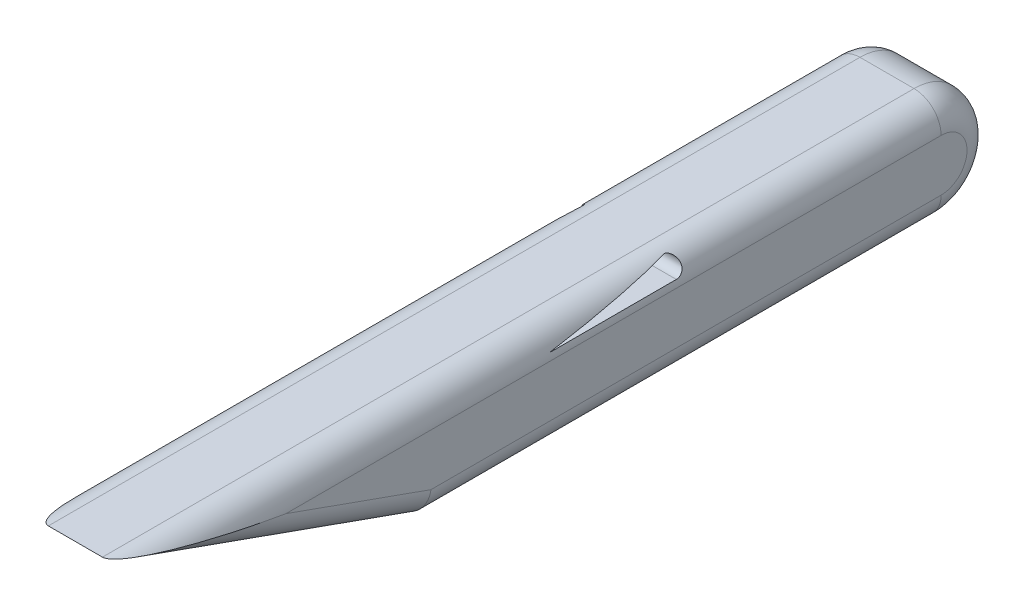
ISO-10303-21;
HEADER;
FILE_DESCRIPTION(('STEP AP214'),'2;1');
FILE_NAME('part.step','',(''),(''),'','','');
FILE_SCHEMA(('AUTOMOTIVE_DESIGN { 1 0 10303 214 1 1 1 1 }'));
ENDSEC;
DATA;
#1=APPLICATION_CONTEXT('core data for automotive mechanical design processes');
#2=APPLICATION_PROTOCOL_DEFINITION('international standard','automotive_design',2000,#1);
#3=PRODUCT_CONTEXT('',#1,'mechanical');
#4=PRODUCT('Part','Part','',(#3));
#5=PRODUCT_RELATED_PRODUCT_CATEGORY('part','',(#4));
#6=PRODUCT_DEFINITION_FORMATION('','',#4);
#7=PRODUCT_DEFINITION_CONTEXT('part definition',#1,'design');
#8=PRODUCT_DEFINITION('design','',#6,#7);
#9=PRODUCT_DEFINITION_SHAPE('','',#8);
#10=(LENGTH_UNIT() NAMED_UNIT(*) SI_UNIT(.MILLI.,.METRE.));
#11=(NAMED_UNIT(*) PLANE_ANGLE_UNIT() SI_UNIT($,.RADIAN.));
#12=(NAMED_UNIT(*) SI_UNIT($,.STERADIAN.) SOLID_ANGLE_UNIT());
#13=UNCERTAINTY_MEASURE_WITH_UNIT(LENGTH_MEASURE(1.E-05),#10,'distance_accuracy_value','');
#14=(GEOMETRIC_REPRESENTATION_CONTEXT(3) GLOBAL_UNCERTAINTY_ASSIGNED_CONTEXT((#13)) GLOBAL_UNIT_ASSIGNED_CONTEXT((#10,
#11,#12)) REPRESENTATION_CONTEXT('',''));
#15=CARTESIAN_POINT('',(0.,0.,0.));
#16=DIRECTION('',(0.,0.,1.));
#17=DIRECTION('',(1.,0.,0.));
#18=AXIS2_PLACEMENT_3D('',#15,#16,#17);
#19=CARTESIAN_POINT('',(-100.,60.4972375690608,537.016574585635));
#20=DIRECTION('',(0.,-1.,0.));
#21=DIRECTION('',(0.,0.,-1.));
#22=AXIS2_PLACEMENT_3D('',#19,#20,#21);
#23=PLANE('',#22);
#24=DIRECTION('',(1.,0.,0.));
#25=VECTOR('',#24,1.);
#26=CARTESIAN_POINT('',(-100.,60.4972375690608,537.016574585635));
#27=LINE('',#26,#25);
#28=CARTESIAN_POINT('',(-50.,60.4972375690608,537.016574585635));
#29=VERTEX_POINT('',#28);
#30=CARTESIAN_POINT('',(50.,60.4972375690608,537.016574585635));
#31=VERTEX_POINT('',#30);
#32=EDGE_CURVE('E251',#29,#31,#27,.T.);
#33=ORIENTED_EDGE('',*,*,#32,.T.);
#34=DIRECTION('',(0.,0.,-1.));
#35=VECTOR('',#34,1.);
#36=CARTESIAN_POINT('',(50.,60.4972375690608,537.016574585635));
#37=LINE('',#36,#35);
#38=CARTESIAN_POINT('',(50.,60.4972375690608,-962.983425414365));
#39=VERTEX_POINT('',#38);
#40=EDGE_CURVE('E300',#31,#39,#37,.T.);
#41=ORIENTED_EDGE('',*,*,#40,.T.);
#42=DIRECTION('',(1.,0.,0.));
#43=VECTOR('',#42,1.);
#44=CARTESIAN_POINT('',(-100.,60.4972375690608,-962.983425414365));
#45=LINE('',#44,#43);
#46=CARTESIAN_POINT('',(-50.,60.4972375690608,-962.983425414365));
#47=VERTEX_POINT('',#46);
#48=EDGE_CURVE('E279',#47,#39,#45,.T.);
#49=ORIENTED_EDGE('',*,*,#48,.F.);
#50=DIRECTION('',(0.,0.,-1.));
#51=VECTOR('',#50,1.);
#52=CARTESIAN_POINT('',(-50.,60.4972375690608,537.016574585635));
#53=LINE('',#52,#51);
#54=EDGE_CURVE('E297',#47,#29,#53,.F.);
#55=ORIENTED_EDGE('',*,*,#54,.T.);
#56=EDGE_LOOP('',(#33,#41,#49,#55));
#57=FACE_BOUND('',#56,.T.);
#58=ADVANCED_FACE('F38',(#57),#23,.F.);
#59=CARTESIAN_POINT('',(-100.,-37.292817679558,-962.983425414365));
#60=DIRECTION('',(1.,0.,0.));
#61=DIRECTION('',(0.,0.,-1.));
#62=AXIS2_PLACEMENT_3D('',#59,#60,#61);
#63=CYLINDRICAL_SURFACE('',#62,97.7900552486188);
#64=DIRECTION('',(1.,0.,0.));
#65=VECTOR('',#64,1.);
#66=CARTESIAN_POINT('',(-100.,-135.082872928177,-962.983425414365));
#67=LINE('',#66,#65);
#68=CARTESIAN_POINT('',(-50.,-135.082872928177,-962.983425414365));
#69=VERTEX_POINT('',#68);
#70=CARTESIAN_POINT('',(50.,-135.082872928177,-962.983425414365));
#71=VERTEX_POINT('',#70);
#72=EDGE_CURVE('E285',#69,#71,#67,.T.);
#73=ORIENTED_EDGE('',*,*,#72,.F.);
#74=CARTESIAN_POINT('',(-50.,-37.292817679558,-962.983425414365));
#75=DIRECTION('',(-1.,0.,0.));
#76=DIRECTION('',(0.,0.,1.));
#77=AXIS2_PLACEMENT_3D('',#74,#75,#76);
#78=CIRCLE('',#77,97.7900552486188);
#79=EDGE_CURVE('E232',#69,#47,#78,.F.);
#80=ORIENTED_EDGE('',*,*,#79,.T.);
#81=ORIENTED_EDGE('',*,*,#48,.T.);
#82=CARTESIAN_POINT('',(50.,-37.292817679558,-962.983425414365));
#83=DIRECTION('',(-1.,0.,0.));
#84=DIRECTION('',(0.,0.,1.));
#85=AXIS2_PLACEMENT_3D('',#82,#83,#84);
#86=CIRCLE('',#85,97.7900552486188);
#87=EDGE_CURVE('E230',#39,#71,#86,.T.);
#88=ORIENTED_EDGE('',*,*,#87,.T.);
#89=EDGE_LOOP('',(#73,#80,#81,#88));
#90=FACE_BOUND('',#89,.T.);
#91=ADVANCED_FACE('F190',(#90),#63,.T.);
#92=CARTESIAN_POINT('',(-100.,-135.082872928177,-11.6022099447516));
#93=DIRECTION('',(0.,-1.,0.));
#94=DIRECTION('',(0.,0.,-1.));
#95=AXIS2_PLACEMENT_3D('',#92,#93,#94);
#96=PLANE('',#95);
#97=DIRECTION('',(1.,0.,0.));
#98=VECTOR('',#97,1.);
#99=CARTESIAN_POINT('',(-100.,-135.082872928177,-11.6022099447516));
#100=LINE('',#99,#98);
#101=CARTESIAN_POINT('',(-50.,-135.082872928177,-11.6022099447516));
#102=VERTEX_POINT('',#101);
#103=CARTESIAN_POINT('',(50.,-135.082872928177,-11.6022099447516));
#104=VERTEX_POINT('',#103);
#105=EDGE_CURVE('E320',#102,#104,#100,.T.);
#106=ORIENTED_EDGE('',*,*,#105,.F.);
#107=DIRECTION('',(0.,0.,-1.));
#108=VECTOR('',#107,1.);
#109=CARTESIAN_POINT('',(-50.,-135.082872928177,-11.6022099447516));
#110=LINE('',#109,#108);
#111=EDGE_CURVE('E278',#102,#69,#110,.T.);
#112=ORIENTED_EDGE('',*,*,#111,.T.);
#113=ORIENTED_EDGE('',*,*,#72,.T.);
#114=DIRECTION('',(0.,0.,-1.));
#115=VECTOR('',#114,1.);
#116=CARTESIAN_POINT('',(50.,-135.082872928177,-11.6022099447516));
#117=LINE('',#116,#115);
#118=EDGE_CURVE('E272',#71,#104,#117,.F.);
#119=ORIENTED_EDGE('',*,*,#118,.T.);
#120=EDGE_LOOP('',(#106,#112,#113,#119));
#121=FACE_BOUND('',#120,.T.);
#122=ADVANCED_FACE('F194',(#121),#96,.T.);
#123=CARTESIAN_POINT('',(-100.,60.4972375690608,537.016574585635));
#124=DIRECTION('',(0.,-0.941934905048124,0.335795525062473));
#125=DIRECTION('',(0.,-0.335795525062473,-0.941934905048124));
#126=AXIS2_PLACEMENT_3D('',#123,#124,#125);
#127=PLANE('',#126);
#128=ORIENTED_EDGE('',*,*,#105,.T.);
#129=DIRECTION('',(0.,-0.335795525062473,-0.941934905048124));
#130=VECTOR('',#129,1.);
#131=CARTESIAN_POINT('',(50.,60.4972375690607,537.016574585635));
#132=LINE('',#131,#130);
#133=EDGE_CURVE('E124',#104,#31,#132,.F.);
#134=ORIENTED_EDGE('',*,*,#133,.T.);
#135=ORIENTED_EDGE('',*,*,#32,.F.);
#136=DIRECTION('',(0.,-0.335795525062473,-0.941934905048124));
#137=VECTOR('',#136,1.);
#138=CARTESIAN_POINT('',(-50.,60.4972375690608,537.016574585635));
#139=LINE('',#138,#137);
#140=EDGE_CURVE('E313',#29,#102,#139,.T.);
#141=ORIENTED_EDGE('',*,*,#140,.T.);
#142=EDGE_LOOP('',(#128,#134,#135,#141));
#143=FACE_BOUND('',#142,.T.);
#144=ADVANCED_FACE('F198',(#143),#127,.T.);
#145=CARTESIAN_POINT('',(-100.,-37.292817679558,-962.983425414365));
#146=DIRECTION('',(-1.,0.,0.));
#147=DIRECTION('',(0.,0.,1.));
#148=AXIS2_PLACEMENT_3D('',#145,#146,#147);
#149=PLANE('',#148);
#150=CARTESIAN_POINT('',(-100.,-37.292817679558,-962.983425414365));
#151=DIRECTION('',(-1.,0.,0.));
#152=DIRECTION('',(0.,0.,1.));
#153=AXIS2_PLACEMENT_3D('',#150,#151,#152);
#154=CIRCLE('',#153,47.7900552486188);
#155=CARTESIAN_POINT('',(-100.,10.4972375690608,-962.983425414365));
#156=VERTEX_POINT('',#155);
#157=CARTESIAN_POINT('',(-100.,-85.0828729281768,-962.983425414365));
#158=VERTEX_POINT('',#157);
#159=EDGE_CURVE('E212',#156,#158,#154,.T.);
#160=ORIENTED_EDGE('',*,*,#159,.T.);
#161=DIRECTION('',(0.,0.,-1.));
#162=VECTOR('',#161,1.);
#163=CARTESIAN_POINT('',(-100.,-85.0828729281768,-962.983425414365));
#164=LINE('',#163,#162);
#165=CARTESIAN_POINT('',(-100.,-85.0828729281768,-20.2481105923367));
#166=VERTEX_POINT('',#165);
#167=EDGE_CURVE('E214',#158,#166,#164,.F.);
#168=ORIENTED_EDGE('',*,*,#167,.T.);
#169=DIRECTION('',(0.,-0.335795525062473,-0.941934905048124));
#170=VECTOR('',#169,1.);
#171=CARTESIAN_POINT('',(-100.,-377.878979313867,-841.566002233553));
#172=LINE('',#171,#170);
#173=CARTESIAN_POINT('',(-100.,10.4972375690608,247.862199361779));
#174=VERTEX_POINT('',#173);
#175=EDGE_CURVE('E221',#166,#174,#172,.F.);
#176=ORIENTED_EDGE('',*,*,#175,.T.);
#177=DIRECTION('',(0.,0.,-1.));
#178=VECTOR('',#177,1.);
#179=CARTESIAN_POINT('',(-100.,10.4972375690608,-962.983425414365));
#180=LINE('',#179,#178);
#181=EDGE_CURVE('E216',#174,#156,#180,.T.);
#182=ORIENTED_EDGE('',*,*,#181,.T.);
#183=EDGE_LOOP('',(#160,#168,#176,#182));
#184=FACE_BOUND('',#183,.T.);
#185=ADVANCED_FACE('F202',(#184),#149,.T.);
#186=CARTESIAN_POINT('',(100.,-37.292817679558,-962.983425414365));
#187=DIRECTION('',(-1.,0.,0.));
#188=DIRECTION('',(0.,0.,1.));
#189=AXIS2_PLACEMENT_3D('',#186,#187,#188);
#190=PLANE('',#189);
#191=CARTESIAN_POINT('',(100.,-37.292817679558,-962.983425414365));
#192=DIRECTION('',(-1.,0.,0.));
#193=DIRECTION('',(0.,0.,1.));
#194=AXIS2_PLACEMENT_3D('',#191,#192,#193);
#195=CIRCLE('',#194,47.7900552486188);
#196=CARTESIAN_POINT('',(100.,-85.0828729281768,-962.983425414365));
#197=VERTEX_POINT('',#196);
#198=CARTESIAN_POINT('',(100.,10.4972375690608,-962.983425414365));
#199=VERTEX_POINT('',#198);
#200=EDGE_CURVE('E266',#197,#199,#195,.F.);
#201=ORIENTED_EDGE('',*,*,#200,.T.);
#202=DIRECTION('',(0.,0.,-1.));
#203=VECTOR('',#202,1.);
#204=CARTESIAN_POINT('',(100.,10.4972375690608,-962.983425414365));
#205=LINE('',#204,#203);
#206=CARTESIAN_POINT('',(100.,10.4972375690608,247.862199361779));
#207=VERTEX_POINT('',#206);
#208=EDGE_CURVE('E310',#199,#207,#205,.F.);
#209=ORIENTED_EDGE('',*,*,#208,.T.);
#210=DIRECTION('',(0.,-0.335795525062473,-0.941934905048124));
#211=VECTOR('',#210,1.);
#212=CARTESIAN_POINT('',(100.,-87.9861276757706,-28.3919861978752));
#213=LINE('',#212,#211);
#214=CARTESIAN_POINT('',(100.,-85.0828729281768,-20.2481105923369));
#215=VERTEX_POINT('',#214);
#216=EDGE_CURVE('E305',#207,#215,#213,.T.);
#217=ORIENTED_EDGE('',*,*,#216,.T.);
#218=DIRECTION('',(0.,0.,-1.));
#219=VECTOR('',#218,1.);
#220=CARTESIAN_POINT('',(100.,-85.0828729281768,-962.983425414365));
#221=LINE('',#220,#219);
#222=EDGE_CURVE('E271',#215,#197,#221,.T.);
#223=ORIENTED_EDGE('',*,*,#222,.T.);
#224=EDGE_LOOP('',(#201,#209,#217,#223));
#225=FACE_BOUND('',#224,.T.);
#226=ADVANCED_FACE('F175',(#225),#190,.F.);
#227=CARTESIAN_POINT('',(-50.,10.4972375690608,-962.983425414365));
#228=DIRECTION('',(0.,0.,1.));
#229=DIRECTION('',(1.,0.,0.));
#230=AXIS2_PLACEMENT_3D('',#227,#228,#229);
#231=CYLINDRICAL_SURFACE('',#230,50.);
#232=CARTESIAN_POINT('',(-50.,10.4972375690608,-142.584254042907));
#233=DIRECTION('',(0.,0.991813732040732,0.127693073169359));
#234=DIRECTION('',(0.,-0.127693073169359,0.991813732040732));
#235=AXIS2_PLACEMENT_3D('',#232,#233,#234);
#236=ELLIPSE('',#235,391.563917752102,50.);
#237=CARTESIAN_POINT('',(-98.3921287125467,23.075070397824,-240.278412459274));
#238=VERTEX_POINT('',#237);
#239=CARTESIAN_POINT('',(-76.2131293745309,53.075070397824,-473.293494818195));
#240=VERTEX_POINT('',#239);
#241=EDGE_CURVE('E131',#238,#240,#236,.F.);
#242=ORIENTED_EDGE('',*,*,#241,.F.);
#243=DIRECTION('',(0.,0.,1.));
#244=VECTOR('',#243,1.);
#245=CARTESIAN_POINT('',(-98.3921287125467,23.075070397824,-962.983425414365));
#246=LINE('',#245,#244);
#247=CARTESIAN_POINT('',(-98.3921287125467,23.075070397824,-475.216763110535));
#248=VERTEX_POINT('',#247);
#249=EDGE_CURVE('E166',#248,#238,#246,.T.);
#250=ORIENTED_EDGE('',*,*,#249,.F.);
#251=CARTESIAN_POINT('',(-76.2131293745309,53.075070397824,-473.293494818195));
#252=CARTESIAN_POINT('',(-76.1860661558049,53.0917311489266,-473.422891268739));
#253=CARTESIAN_POINT('',(-76.1615766879769,53.1067734767004,-473.553019265863));
#254=CARTESIAN_POINT('',(-76.1179503993199,53.1335288176571,-473.814522892841));
#255=CARTESIAN_POINT('',(-76.0988141890835,53.1452414510573,-473.94589866325));
#256=CARTESIAN_POINT('',(-76.0497662485183,53.175231985413,-474.341412060919));
#257=CARTESIAN_POINT('',(-76.0281906710761,53.1883775658046,-474.607051740177));
#258=CARTESIAN_POINT('',(-76.0083865758643,53.2004453281729,-475.135954027014));
#259=CARTESIAN_POINT('',(-76.0098521925775,53.1995538480198,-475.399201431973));
#260=CARTESIAN_POINT('',(-76.0353068772643,53.1840389655784,-475.924151423903));
#261=CARTESIAN_POINT('',(-76.0592921565998,53.1694178731174,-476.185854263275));
#262=CARTESIAN_POINT('',(-76.1287817412727,53.1269033343035,-476.705251658752));
#263=CARTESIAN_POINT('',(-76.1742859219905,53.0990099648125,-476.962946238061));
#264=CARTESIAN_POINT('',(-76.2851104237276,53.0307207089366,-477.472454719863));
#265=CARTESIAN_POINT('',(-76.3504422949576,52.9903175349462,-477.724265102311));
#266=CARTESIAN_POINT('',(-76.4989246068854,52.8978818588846,-478.220986880419));
#267=CARTESIAN_POINT('',(-76.5821159240868,52.8458226667062,-478.46588096617));
#268=CARTESIAN_POINT('',(-76.7639418363139,52.7311454675172,-478.947353961216));
#269=CARTESIAN_POINT('',(-76.8625820600983,52.6685236113918,-479.183929801164));
#270=CARTESIAN_POINT('',(-77.1205865372794,52.5032681699552,-479.753141415685));
#271=CARTESIAN_POINT('',(-77.2872621895402,52.3953334188314,-480.080932231885));
#272=CARTESIAN_POINT('',(-77.6423788324121,52.1618997952058,-480.717927427669));
#273=CARTESIAN_POINT('',(-77.830830713869,52.0363921273414,-481.027122388434));
#274=CARTESIAN_POINT('',(-78.2250145038573,51.7695690335127,-481.628243939883));
#275=CARTESIAN_POINT('',(-78.4307874056819,51.6282158284278,-481.920126610013));
#276=CARTESIAN_POINT('',(-78.855292741656,51.3315264742434,-482.486744478169));
#277=CARTESIAN_POINT('',(-79.0740245799212,51.1761909679147,-482.761480463451));
#278=CARTESIAN_POINT('',(-79.483252525842,50.8802820442464,-483.249309438808));
#279=CARTESIAN_POINT('',(-79.6722040413336,50.7417074934824,-483.46492578098));
#280=CARTESIAN_POINT('',(-80.0555647733004,50.4562191442097,-483.885546529565));
#281=CARTESIAN_POINT('',(-80.2499746879177,50.3093042764763,-484.090549568887));
#282=CARTESIAN_POINT('',(-80.8397701185598,49.8565300685958,-484.690446453609));
#283=CARTESIAN_POINT('',(-81.2416105847442,49.5387206429353,-485.070098312848));
#284=CARTESIAN_POINT('',(-82.0553696183355,48.8734029863475,-485.791149002883));
#285=CARTESIAN_POINT('',(-82.4672957091157,48.525872071179,-486.132518147648));
#286=CARTESIAN_POINT('',(-83.2956591526193,47.802750489521,-486.777723949883));
#287=CARTESIAN_POINT('',(-83.7120955478556,47.4271656824638,-487.081568409904));
#288=CARTESIAN_POINT('',(-84.5646528250736,46.6308867777131,-487.66494125111));
#289=CARTESIAN_POINT('',(-85.0007922067502,46.2089091579908,-487.942691945272));
#290=CARTESIAN_POINT('',(-85.869448804699,45.3363203276017,-488.455917654212));
#291=CARTESIAN_POINT('',(-86.3019655829175,44.8857057090817,-488.691387624708));
#292=CARTESIAN_POINT('',(-87.1591611148901,43.9575930348535,-489.117524678619));
#293=CARTESIAN_POINT('',(-87.5838475270273,43.4801233236798,-489.308237940471));
#294=CARTESIAN_POINT('',(-88.4222130458552,42.4995713361374,-489.641980499523));
#295=CARTESIAN_POINT('',(-88.835894402564,41.9964943574944,-489.785019613878));
#296=CARTESIAN_POINT('',(-89.5817728097609,41.051836916716,-490.000193522881));
#297=CARTESIAN_POINT('',(-89.916173518591,40.6137654496871,-490.080124101794));
#298=CARTESIAN_POINT('',(-90.5727214649987,39.7232558448999,-490.201357281472));
#299=CARTESIAN_POINT('',(-90.8948692132123,39.2708183072855,-490.242661493668));
#300=CARTESIAN_POINT('',(-91.5244722017212,38.3544979066759,-490.283813302015));
#301=CARTESIAN_POINT('',(-91.8319397989563,37.8906251863988,-490.283696402183));
#302=CARTESIAN_POINT('',(-92.4302900576043,36.9543524531751,-490.239240268254));
#303=CARTESIAN_POINT('',(-92.7211752572597,36.4819537599399,-490.194907821481));
#304=CARTESIAN_POINT('',(-93.2400550047992,35.6072797282782,-490.069997785664));
#305=CARTESIAN_POINT('',(-93.4707548165025,35.205635161574,-489.996200857184));
#306=CARTESIAN_POINT('',(-93.9177108115911,34.4021722546981,-489.813888700053));
#307=CARTESIAN_POINT('',(-94.1339683849478,34.0003539350064,-489.705376818326));
#308=CARTESIAN_POINT('',(-94.550961016702,33.200000666979,-489.45256854375));
#309=CARTESIAN_POINT('',(-94.7516992034924,32.8014650714607,-489.308279387672));
#310=CARTESIAN_POINT('',(-95.1368463442531,32.011378125191,-488.98324132239));
#311=CARTESIAN_POINT('',(-95.3212550597939,31.619826876486,-488.802491880949));
#312=CARTESIAN_POINT('',(-95.674051529157,30.845772962618,-488.403346410543));
#313=CARTESIAN_POINT('',(-95.8423491296559,30.4633292992862,-488.184755808317));
#314=CARTESIAN_POINT('',(-96.1614671153626,29.7140221543754,-487.711077343667));
#315=CARTESIAN_POINT('',(-96.3122872038159,29.3471589374071,-487.455988861702));
#316=CARTESIAN_POINT('',(-96.5963745852547,28.6335374804009,-486.91054124964));
#317=CARTESIAN_POINT('',(-96.72964637489,28.2867741026947,-486.620191191917));
#318=CARTESIAN_POINT('',(-96.9789432690378,27.6175882733234,-486.005987457923));
#319=CARTESIAN_POINT('',(-97.0949699768757,27.2951635601953,-485.682136901044));
#320=CARTESIAN_POINT('',(-97.3000981303651,26.7079780520142,-485.035590978876));
#321=CARTESIAN_POINT('',(-97.3907097459217,26.4406486396114,-484.715701360626));
#322=CARTESIAN_POINT('',(-97.5588023380092,25.9320060987271,-484.05264453576));
#323=CARTESIAN_POINT('',(-97.6362840706788,25.6906914723677,-483.709478671197));
#324=CARTESIAN_POINT('',(-97.7787743718996,25.2364852234758,-483.002256500815));
#325=CARTESIAN_POINT('',(-97.8437798627559,25.023600618117,-482.638195069083));
#326=CARTESIAN_POINT('',(-97.9619733841175,24.6284676641064,-481.891987467251));
#327=CARTESIAN_POINT('',(-98.0151619262409,24.4462179891898,-481.509842080971));
#328=CARTESIAN_POINT('',(-98.1086849029213,24.1200925727883,-480.744359139092));
#329=CARTESIAN_POINT('',(-98.1494113336005,23.9750766575785,-480.361553996936));
#330=CARTESIAN_POINT('',(-98.2210518749551,23.7164736202522,-479.584528836578));
#331=CARTESIAN_POINT('',(-98.2519662048284,23.6028857960533,-479.190309073588));
#332=CARTESIAN_POINT('',(-98.2912939872454,23.4569217262076,-478.592972823342));
#333=CARTESIAN_POINT('',(-98.303223952331,23.4123572083721,-478.392988503407));
#334=CARTESIAN_POINT('',(-98.3247945239542,23.331410062747,-477.991300935711));
#335=CARTESIAN_POINT('',(-98.3344356485953,23.2950255834172,-477.789598087687));
#336=CARTESIAN_POINT('',(-98.3599826731865,23.1982869247802,-477.182535181569));
#337=CARTESIAN_POINT('',(-98.3725293300986,23.1502833980208,-476.774958364486));
#338=CARTESIAN_POINT('',(-98.3845118375116,23.1043462260912,-476.174837633088));
#339=CARTESIAN_POINT('',(-98.3873716352499,23.0933615403739,-475.983247256147));
#340=CARTESIAN_POINT('',(-98.3911779610612,23.0787294158165,-475.600035816573));
#341=CARTESIAN_POINT('',(-98.3921271586876,23.0750717394722,-475.408415171399));
#342=CARTESIAN_POINT('',(-98.3921287125467,23.075070397824,-475.216763110535));
#343=B_SPLINE_CURVE_WITH_KNOTS('',3,(#251,#252,#253,#254,#255,#256,#257,#258,#259,#260,#261,
#262,#263,#264,#265,#266,#267,#268,#269,#270,#271,#272,#273,#274,#275,#276,#277,#278,#279,#280,
#281,#282,#283,#284,#285,#286,#287,#288,#289,#290,#291,#292,#293,#294,#295,#296,#297,#298,#299,
#300,#301,#302,#303,#304,#305,#306,#307,#308,#309,#310,#311,#312,#313,#314,#315,#316,#317,#318,
#319,#320,#321,#322,#323,#324,#325,#326,#327,#328,#329,#330,#331,#332,#333,#334,#335,#336,#337,
#338,#339,#340,#341,#342),.UNSPECIFIED.,.F.,.F.,(4,2,2,2,2,2,2,2,2,2,2,2,2,2,2,2,2,2,2,2,2,2,2,
2,2,2,2,2,2,2,2,2,2,2,2,2,2,2,2,2,2,2,2,2,2,4),(0.,0.39965523926802,0.799356044656879,
1.5984007548497,2.38684742759157,3.17516147827402,3.96347096374642,4.75224054689797,
5.54283507987244,6.33371833637882,7.48161474741214,8.63008775581348,9.78135966853867,
10.9325786839231,11.8875100138683,12.8425640432475,14.7532347757668,16.6653770250226,
18.5771210084698,20.5773971156598,22.5779117065845,24.5763530703549,26.5743826564529,
28.2435101560063,29.9125680191107,31.5801952562738,33.2475665430468,34.6532462028124,
36.0587903795229,37.4640504843374,38.8693311042207,40.2820645726681,41.6948220247091,
43.1072167584151,44.5194800954185,45.7977483678304,47.0759430008297,48.3544525404352,
49.6329067158128,50.8655939793138,52.0982537031886,52.7138024818521,53.3292117913284,
54.5592209107934,55.1348819414561,55.7097380796917),.UNSPECIFIED.);
#344=EDGE_CURVE('E159',#240,#248,#343,.T.);
#345=ORIENTED_EDGE('',*,*,#344,.F.);
#346=EDGE_LOOP('',(#242,#250,#345));
#347=FACE_BOUND('',#346,.T.);
#348=CARTESIAN_POINT('',(-50.,10.4972375690608,-962.983425414365));
#349=DIRECTION('',(0.,0.,-1.));
#350=DIRECTION('',(-1.,0.,0.));
#351=AXIS2_PLACEMENT_3D('',#348,#349,#350);
#352=CIRCLE('',#351,50.);
#353=EDGE_CURVE('E238',#156,#47,#352,.T.);
#354=ORIENTED_EDGE('',*,*,#353,.F.);
#355=ORIENTED_EDGE('',*,*,#181,.F.);
#356=CARTESIAN_POINT('',(-50.,10.4972375690608,247.862199361779));
#357=DIRECTION('',(0.,-0.985376807380842,0.170389399540987));
#358=DIRECTION('',(0.,0.170389399540987,0.985376807380842));
#359=AXIS2_PLACEMENT_3D('',#356,#357,#358);
#360=ELLIPSE('',#359,293.445485075335,50.);
#361=EDGE_CURVE('E247',#29,#174,#360,.T.);
#362=ORIENTED_EDGE('',*,*,#361,.F.);
#363=ORIENTED_EDGE('',*,*,#54,.F.);
#364=EDGE_LOOP('',(#354,#355,#362,#363));
#365=FACE_BOUND('',#364,.T.);
#366=ADVANCED_FACE('F170',(#347,#365),#231,.T.);
#367=CARTESIAN_POINT('',(-50.,107.593982821467,520.226798332512));
#368=DIRECTION('',(0.,-0.335795525062473,-0.941934905048124));
#369=DIRECTION('',(0.,0.941934905048124,-0.335795525062473));
#370=AXIS2_PLACEMENT_3D('',#367,#368,#369);
#371=CYLINDRICAL_SURFACE('',#370,50.);
#372=ORIENTED_EDGE('',*,*,#361,.T.);
#373=ORIENTED_EDGE('',*,*,#175,.F.);
#374=CARTESIAN_POINT('',(-50.,-85.0828729281768,-20.2481105923367));
#375=DIRECTION('',(0.,-0.170389399540987,-0.985376807380842));
#376=DIRECTION('',(0.,-0.985376807380842,0.170389399540987));
#377=AXIS2_PLACEMENT_3D('',#374,#375,#376);
#378=ELLIPSE('',#377,50.7420101888752,50.);
#379=EDGE_CURVE('E227',#102,#166,#378,.T.);
#380=ORIENTED_EDGE('',*,*,#379,.F.);
#381=ORIENTED_EDGE('',*,*,#140,.F.);
#382=EDGE_LOOP('',(#372,#373,#380,#381));
#383=FACE_BOUND('',#382,.T.);
#384=ADVANCED_FACE('F174',(#383),#371,.T.);
#385=CARTESIAN_POINT('',(-50.,-37.292817679558,-962.983425414365));
#386=DIRECTION('',(-1.,0.,0.));
#387=DIRECTION('',(0.,0.,1.));
#388=AXIS2_PLACEMENT_3D('',#385,#386,#387);
#389=DEGENERATE_TOROIDAL_SURFACE('',#388,47.7900552486188,50.,.T.);
#390=ORIENTED_EDGE('',*,*,#353,.T.);
#391=ORIENTED_EDGE('',*,*,#79,.F.);
#392=CARTESIAN_POINT('',(-50.,-85.0828729281768,-962.983425414365));
#393=DIRECTION('',(0.,0.,1.));
#394=DIRECTION('',(1.,0.,0.));
#395=AXIS2_PLACEMENT_3D('',#392,#393,#394);
#396=CIRCLE('',#395,50.);
#397=EDGE_CURVE('E224',#158,#69,#396,.T.);
#398=ORIENTED_EDGE('',*,*,#397,.F.);
#399=ORIENTED_EDGE('',*,*,#159,.F.);
#400=EDGE_LOOP('',(#390,#391,#398,#399));
#401=FACE_BOUND('',#400,.T.);
#402=ADVANCED_FACE('F179',(#401),#389,.T.);
#403=CARTESIAN_POINT('',(-50.,-85.0828729281768,-11.6022099447516));
#404=DIRECTION('',(0.,0.,-1.));
#405=DIRECTION('',(-1.,0.,0.));
#406=AXIS2_PLACEMENT_3D('',#403,#404,#405);
#407=CYLINDRICAL_SURFACE('',#406,50.);
#408=ORIENTED_EDGE('',*,*,#379,.T.);
#409=ORIENTED_EDGE('',*,*,#167,.F.);
#410=ORIENTED_EDGE('',*,*,#397,.T.);
#411=ORIENTED_EDGE('',*,*,#111,.F.);
#412=EDGE_LOOP('',(#408,#409,#410,#411));
#413=FACE_BOUND('',#412,.T.);
#414=ADVANCED_FACE('F183',(#413),#407,.T.);
#415=CARTESIAN_POINT('',(50.,-85.0828729281768,-962.983425414365));
#416=DIRECTION('',(0.,0.,1.));
#417=DIRECTION('',(1.,0.,0.));
#418=AXIS2_PLACEMENT_3D('',#415,#416,#417);
#419=CYLINDRICAL_SURFACE('',#418,50.);
#420=CARTESIAN_POINT('',(50.,-85.0828729281768,-962.983425414365));
#421=DIRECTION('',(0.,0.,-1.));
#422=DIRECTION('',(-1.,0.,0.));
#423=AXIS2_PLACEMENT_3D('',#420,#421,#422);
#424=CIRCLE('',#423,50.);
#425=EDGE_CURVE('E241',#197,#71,#424,.T.);
#426=ORIENTED_EDGE('',*,*,#425,.F.);
#427=ORIENTED_EDGE('',*,*,#222,.F.);
#428=CARTESIAN_POINT('',(50.,-85.0828729281768,-20.2481105923367));
#429=DIRECTION('',(0.,0.170389399540987,0.985376807380842));
#430=DIRECTION('',(0.,-0.985376807380842,0.170389399540987));
#431=AXIS2_PLACEMENT_3D('',#428,#429,#430);
#432=ELLIPSE('',#431,50.7420101888752,50.);
#433=EDGE_CURVE('E146',#104,#215,#432,.T.);
#434=ORIENTED_EDGE('',*,*,#433,.F.);
#435=ORIENTED_EDGE('',*,*,#118,.F.);
#436=EDGE_LOOP('',(#426,#427,#434,#435));
#437=FACE_BOUND('',#436,.T.);
#438=ADVANCED_FACE('F40',(#437),#419,.T.);
#439=CARTESIAN_POINT('',(50.,-377.878979313867,-841.566002233553));
#440=DIRECTION('',(0.,0.335795525062473,0.941934905048124));
#441=DIRECTION('',(0.,-0.941934905048124,0.335795525062473));
#442=AXIS2_PLACEMENT_3D('',#439,#440,#441);
#443=CYLINDRICAL_SURFACE('',#442,50.);
#444=ORIENTED_EDGE('',*,*,#433,.T.);
#445=ORIENTED_EDGE('',*,*,#216,.F.);
#446=CARTESIAN_POINT('',(50.,10.4972375690607,247.862199361778));
#447=DIRECTION('',(0.,0.985376807380842,-0.170389399540987));
#448=DIRECTION('',(0.,0.170389399540987,0.985376807380842));
#449=AXIS2_PLACEMENT_3D('',#446,#447,#448);
#450=ELLIPSE('',#449,293.445485075335,50.);
#451=EDGE_CURVE('E255',#31,#207,#450,.T.);
#452=ORIENTED_EDGE('',*,*,#451,.F.);
#453=ORIENTED_EDGE('',*,*,#133,.F.);
#454=EDGE_LOOP('',(#444,#445,#452,#453));
#455=FACE_BOUND('',#454,.T.);
#456=ADVANCED_FACE('F329',(#455),#443,.T.);
#457=CARTESIAN_POINT('',(50.,-37.292817679558,-962.983425414365));
#458=DIRECTION('',(-1.,0.,0.));
#459=DIRECTION('',(0.,0.,1.));
#460=AXIS2_PLACEMENT_3D('',#457,#458,#459);
#461=DEGENERATE_TOROIDAL_SURFACE('',#460,47.7900552486188,50.,.T.);
#462=ORIENTED_EDGE('',*,*,#425,.T.);
#463=ORIENTED_EDGE('',*,*,#87,.F.);
#464=CARTESIAN_POINT('',(50.,10.4972375690608,-962.983425414365));
#465=DIRECTION('',(0.,0.,1.));
#466=DIRECTION('',(1.,0.,0.));
#467=AXIS2_PLACEMENT_3D('',#464,#465,#466);
#468=CIRCLE('',#467,50.);
#469=EDGE_CURVE('E252',#199,#39,#468,.T.);
#470=ORIENTED_EDGE('',*,*,#469,.F.);
#471=ORIENTED_EDGE('',*,*,#200,.F.);
#472=EDGE_LOOP('',(#462,#463,#470,#471));
#473=FACE_BOUND('',#472,.T.);
#474=ADVANCED_FACE('F263',(#473),#461,.T.);
#475=CARTESIAN_POINT('',(50.,10.4972375690608,537.016574585635));
#476=DIRECTION('',(0.,0.,-1.));
#477=DIRECTION('',(-1.,0.,0.));
#478=AXIS2_PLACEMENT_3D('',#475,#476,#477);
#479=CYLINDRICAL_SURFACE('',#478,50.);
#480=CARTESIAN_POINT('',(50.,10.4972375690608,-142.584254042907));
#481=DIRECTION('',(0.,0.991813732040732,0.127693073169359));
#482=DIRECTION('',(0.,0.127693073169359,-0.991813732040732));
#483=AXIS2_PLACEMENT_3D('',#480,#481,#482);
#484=ELLIPSE('',#483,391.563917752102,50.);
#485=CARTESIAN_POINT('',(76.2131293745309,53.075070397824,-473.293494818195));
#486=VERTEX_POINT('',#485);
#487=CARTESIAN_POINT('',(98.3921287125467,23.075070397824,-240.278412459274));
#488=VERTEX_POINT('',#487);
#489=EDGE_CURVE('E11',#486,#488,#484,.F.);
#490=ORIENTED_EDGE('',*,*,#489,.F.);
#491=CARTESIAN_POINT('',(98.3921287125467,23.075070397824,-475.216763110535));
#492=CARTESIAN_POINT('',(98.3921269225219,23.0750702196927,-475.421665998756));
#493=CARTESIAN_POINT('',(98.3910419735558,23.0792524411314,-475.626543988174));
#494=CARTESIAN_POINT('',(98.3866934463289,23.0959678607067,-476.035935417779));
#495=CARTESIAN_POINT('',(98.3834298724991,23.1085010418585,-476.240448858707));
#496=CARTESIAN_POINT('',(98.3703550113471,23.1585976144945,-476.852865100295));
#497=CARTESIAN_POINT('',(98.3572595959642,23.2086580505936,-477.259750910676));
#498=CARTESIAN_POINT('',(98.3221102242155,23.3416276053831,-478.067368100242));
#499=CARTESIAN_POINT('',(98.3000627891221,23.4245128111528,-478.468103739572));
#500=CARTESIAN_POINT('',(98.2466585182187,23.6224210373903,-479.260934267906));
#501=CARTESIAN_POINT('',(98.2153018254861,23.7374435639261,-479.653029289611));
#502=CARTESIAN_POINT('',(98.142797669066,23.9986968511294,-480.425997737991));
#503=CARTESIAN_POINT('',(98.1016446202814,24.1449454094572,-480.806864623565));
#504=CARTESIAN_POINT('',(98.0090119185825,24.4673084176849,-481.554441439934));
#505=CARTESIAN_POINT('',(97.9575322653483,24.6434228685099,-481.92115137029));
#506=CARTESIAN_POINT('',(97.8436706581594,25.0238532912843,-482.637713682661));
#507=CARTESIAN_POINT('',(97.781292234296,25.2281601272827,-482.987571476387));
#508=CARTESIAN_POINT('',(97.6450194643459,25.6631214556882,-483.668136602912));
#509=CARTESIAN_POINT('',(97.5711251892857,25.8937757855893,-483.998844053807));
#510=CARTESIAN_POINT('',(97.411268688057,26.3792040058006,-484.638831653865));
#511=CARTESIAN_POINT('',(97.3253090759656,26.6339726676142,-484.948116422847));
#512=CARTESIAN_POINT('',(97.1408176195252,27.1652415665113,-485.543383859061));
#513=CARTESIAN_POINT('',(97.0422858149468,27.4417417348488,-485.829366600001));
#514=CARTESIAN_POINT('',(96.8322603051347,28.0138649973412,-486.376411768185));
#515=CARTESIAN_POINT('',(96.7207651538476,28.3094902232496,-486.637471409346));
#516=CARTESIAN_POINT('',(96.4845904009217,28.9170383470458,-487.133327761143));
#517=CARTESIAN_POINT('',(96.3599106336492,29.228961449653,-487.368124141768));
#518=CARTESIAN_POINT('',(96.0949877817044,29.8718359317906,-487.814412848741));
#519=CARTESIAN_POINT('',(95.9545091392702,30.2030257778483,-488.025421546555));
#520=CARTESIAN_POINT('',(95.6599555772914,30.8762326913608,-488.41867920548));
#521=CARTESIAN_POINT('',(95.5058805686777,31.2182498297351,-488.600927978164));
#522=CARTESIAN_POINT('',(95.1844306847738,31.9101480399705,-488.936491047036));
#523=CARTESIAN_POINT('',(95.0170548859987,32.2600296566571,-489.089803331641));
#524=CARTESIAN_POINT('',(94.6694887719775,32.9647957704666,-489.367663576638));
#525=CARTESIAN_POINT('',(94.489297986082,33.3196804509503,-489.492210479864));
#526=CARTESIAN_POINT('',(94.1036028330515,34.0568894936688,-489.720814079259));
#527=CARTESIAN_POINT('',(93.8972094436382,34.4393869566945,-489.822811349125));
#528=CARTESIAN_POINT('',(93.471358453393,35.2041718688469,-489.995367443578));
#529=CARTESIAN_POINT('',(93.251900318558,35.5864593087438,-490.06592498211));
#530=CARTESIAN_POINT('',(92.8008641488643,36.3483900676524,-490.176823976827));
#531=CARTESIAN_POINT('',(92.5692822673689,36.7280325036318,-490.217155780029));
#532=CARTESIAN_POINT('',(92.0951220887599,37.4824048548556,-490.268943485994));
#533=CARTESIAN_POINT('',(91.852542384877,37.8571341336928,-490.280395683998));
#534=CARTESIAN_POINT('',(91.3214931983418,38.6538610496524,-490.275540941646));
#535=CARTESIAN_POINT('',(91.0314811421237,39.0748058312866,-490.254953965453));
#536=CARTESIAN_POINT('',(90.4401826728792,39.9055985934481,-490.17999664325));
#537=CARTESIAN_POINT('',(90.1388952973941,40.3154456215037,-490.125623407041));
#538=CARTESIAN_POINT('',(89.5266233710432,41.1224339153905,-489.985195201829));
#539=CARTESIAN_POINT('',(89.2156357822549,41.5195711202289,-489.899130214509));
#540=CARTESIAN_POINT('',(88.5856939439185,42.2996848996883,-489.697279563634));
#541=CARTESIAN_POINT('',(88.26673937048,42.6826608970235,-489.581492689983));
#542=CARTESIAN_POINT('',(87.5571188864523,43.509609751403,-489.295598884711));
#543=CARTESIAN_POINT('',(87.1650261983381,43.950204464843,-489.119238117588));
#544=CARTESIAN_POINT('',(86.3744152549184,44.8082031947976,-488.728494171193));
#545=CARTESIAN_POINT('',(85.9758959831474,45.2256034954013,-488.514104922417));
#546=CARTESIAN_POINT('',(85.1747924692244,46.03678418739,-488.048802407091));
#547=CARTESIAN_POINT('',(84.7722031181549,46.4305290021543,-487.797835980838));
#548=CARTESIAN_POINT('',(83.9667472188872,47.1928433228575,-487.26073755293));
#549=CARTESIAN_POINT('',(83.5638807056718,47.5614155671979,-486.97460938586));
#550=CARTESIAN_POINT('',(82.7775592038441,48.25828133458,-486.379590786184));
#551=CARTESIAN_POINT('',(82.3939729783442,48.5875968260766,-486.072070917609));
#552=CARTESIAN_POINT('',(81.6337131469436,49.2213001963758,-485.42415203162));
#553=CARTESIAN_POINT('',(81.2570412461743,49.5256819887301,-485.083745030218));
#554=CARTESIAN_POINT('',(80.5166409880623,50.1072836250902,-484.369393817154));
#555=CARTESIAN_POINT('',(80.1528865675761,50.3845604047838,-483.995523208896));
#556=CARTESIAN_POINT('',(79.4445348787919,50.9102718785658,-483.211286151747));
#557=CARTESIAN_POINT('',(79.0999238947292,51.1587273649444,-482.800946394698));
#558=CARTESIAN_POINT('',(78.5948210619787,51.5140914311367,-482.14253567415));
#559=CARTESIAN_POINT('',(78.4238501160908,51.6326877632122,-481.90873424792));
#560=CARTESIAN_POINT('',(78.0920594233016,51.8599811062406,-481.429313528821));
#561=CARTESIAN_POINT('',(77.9312401787738,51.9686776274027,-481.183693652154));
#562=CARTESIAN_POINT('',(77.6223209414341,52.1750719925429,-480.680446634903));
#563=CARTESIAN_POINT('',(77.4742091905431,52.2727800306233,-480.422830942033));
#564=CARTESIAN_POINT('',(77.1934317346502,52.4560908817885,-479.895104576953));
#565=CARTESIAN_POINT('',(77.060764483351,52.5416949069069,-479.624995159401));
#566=CARTESIAN_POINT('',(76.8375203417368,52.6844586041126,-479.124564505439));
#567=CARTESIAN_POINT('',(76.7437238049726,52.743938129861,-478.896344083221));
#568=CARTESIAN_POINT('',(76.5705721275261,52.8530538102292,-478.432281581889));
#569=CARTESIAN_POINT('',(76.4912097532961,52.9026948964177,-478.196443390522));
#570=CARTESIAN_POINT('',(76.3489886447195,52.991211530939,-477.718055652991));
#571=CARTESIAN_POINT('',(76.2861157206055,53.0300963370271,-477.475512077084));
#572=CARTESIAN_POINT('',(76.1787236203907,53.0962801833008,-476.984833643608));
#573=CARTESIAN_POINT('',(76.1342012844594,53.1235812181468,-476.736699756416));
#574=CARTESIAN_POINT('',(76.0688605020156,53.1635686435147,-476.264134668945));
#575=CARTESIAN_POINT('',(76.0459741203652,53.1775318243241,-476.040096878916));
#576=CARTESIAN_POINT('',(76.0166539138938,53.195411103862,-475.590516380937));
#577=CARTESIAN_POINT('',(76.0102210155007,53.1993266368489,-475.364973588963));
#578=CARTESIAN_POINT('',(76.0140128285824,53.1970167064963,-474.914318807904));
#579=CARTESIAN_POINT('',(76.0242208040321,53.1908014318922,-474.689206613669));
#580=CARTESIAN_POINT('',(76.0609409601581,53.1683966545308,-474.240905389198));
#581=CARTESIAN_POINT('',(76.0874452539519,53.15221197663,-474.01771548159));
#582=CARTESIAN_POINT('',(76.1347322066187,53.1232389711397,-473.711862679084));
#583=CARTESIAN_POINT('',(76.1489023008427,53.1145489305945,-473.627725442411));
#584=CARTESIAN_POINT('',(76.1794067238627,53.0958171836266,-473.460124622787));
#585=CARTESIAN_POINT('',(76.1957378391649,53.0857774838354,-473.376660231097));
#586=CARTESIAN_POINT('',(76.2131293745311,53.075070397824,-473.293494818196));
#587=B_SPLINE_CURVE_WITH_KNOTS('',3,(#491,#492,#493,#494,#495,#496,#497,#498,#499,#500,#501,
#502,#503,#504,#505,#506,#507,#508,#509,#510,#511,#512,#513,#514,#515,#516,#517,#518,#519,#520,
#521,#522,#523,#524,#525,#526,#527,#528,#529,#530,#531,#532,#533,#534,#535,#536,#537,#538,#539,
#540,#541,#542,#543,#544,#545,#546,#547,#548,#549,#550,#551,#552,#553,#554,#555,#556,#557,#558,
#559,#560,#561,#562,#563,#564,#565,#566,#567,#568,#569,#570,#571,#572,#573,#574,#575,#576,#577,
#578,#579,#580,#581,#582,#583,#584,#585,#586),.UNSPECIFIED.,.F.,.F.,(4,2,2,2,2,2,2,2,2,2,2,2,2,
2,2,2,2,2,2,2,2,2,2,2,2,2,2,2,2,2,2,2,2,2,2,2,2,2,2,2,2,2,2,2,2,2,2,4),(0.,0.61461338925684,
1.22922552846693,2.45812956619487,3.68613998649842,4.91413153403437,6.14282486776724,
7.37151823955499,8.59981437516092,9.82810293529571,11.0561257839256,12.2841447479496,
13.5123008283918,14.7404723395541,15.9902887123912,17.2401132733275,18.4900246865575,
19.7399820283565,21.077924577397,22.4159218505471,23.7543462487103,25.0929423350604,
26.626245396916,28.159679641047,29.6935990472607,31.2275809153736,33.072610905641,
34.9179356357412,36.7659695317669,38.6138020678899,40.3876295176474,42.1618886857132,
43.9323370050987,45.7015000361618,46.6400137338744,47.5785738391255,48.5162559242961,
49.4538440482083,50.2146470892541,50.9750678039463,51.7348319859696,52.4944652877176,
53.1705811049206,53.8467349905829,54.522209275601,55.1973569103047,55.4546169462006,
55.711498640891),.UNSPECIFIED.);
#588=CARTESIAN_POINT('',(98.3921287125467,23.075070397824,-475.216763110535));
#589=VERTEX_POINT('',#588);
#590=EDGE_CURVE('E118',#589,#486,#587,.T.);
#591=ORIENTED_EDGE('',*,*,#590,.F.);
#592=DIRECTION('',(0.,0.,-1.));
#593=VECTOR('',#592,1.);
#594=CARTESIAN_POINT('',(98.3921287125467,23.075070397824,537.016574585635));
#595=LINE('',#594,#593);
#596=EDGE_CURVE('E47',#488,#589,#595,.T.);
#597=ORIENTED_EDGE('',*,*,#596,.F.);
#598=EDGE_LOOP('',(#490,#591,#597));
#599=FACE_BOUND('',#598,.T.);
#600=ORIENTED_EDGE('',*,*,#451,.T.);
#601=ORIENTED_EDGE('',*,*,#208,.F.);
#602=ORIENTED_EDGE('',*,*,#469,.T.);
#603=ORIENTED_EDGE('',*,*,#40,.F.);
#604=EDGE_LOOP('',(#600,#601,#602,#603));
#605=FACE_BOUND('',#604,.T.);
#606=ADVANCED_FACE('F135',(#599,#605),#479,.T.);
#607=CARTESIAN_POINT('',(200.,53.075070397824,-473.293494818195));
#608=DIRECTION('',(0.,0.991813732040732,0.127693073169359));
#609=DIRECTION('',(0.,-0.127693073169359,0.991813732040732));
#610=AXIS2_PLACEMENT_3D('',#607,#608,#609);
#611=PLANE('',#610);
#612=ORIENTED_EDGE('',*,*,#241,.T.);
#613=DIRECTION('',(-1.,0.,0.));
#614=VECTOR('',#613,1.);
#615=CARTESIAN_POINT('',(200.,53.075070397824,-473.293494818195));
#616=LINE('',#615,#614);
#617=EDGE_CURVE('E54',#486,#240,#616,.T.);
#618=ORIENTED_EDGE('',*,*,#617,.F.);
#619=ORIENTED_EDGE('',*,*,#489,.T.);
#620=DIRECTION('',(-1.,0.,0.));
#621=VECTOR('',#620,1.);
#622=CARTESIAN_POINT('',(200.,23.075070397824,-240.278412459274));
#623=LINE('',#622,#621);
#624=EDGE_CURVE('E167',#488,#238,#623,.T.);
#625=ORIENTED_EDGE('',*,*,#624,.T.);
#626=EDGE_LOOP('',(#612,#618,#619,#625));
#627=FACE_BOUND('',#626,.T.);
#628=ADVANCED_FACE('F127',(#627),#611,.F.);
#629=CARTESIAN_POINT('',(200.,23.075070397824,-240.278412459274));
#630=DIRECTION('',(0.,-1.,0.));
#631=DIRECTION('',(0.,0.,-1.));
#632=AXIS2_PLACEMENT_3D('',#629,#630,#631);
#633=PLANE('',#632);
#634=ORIENTED_EDGE('',*,*,#249,.T.);
#635=ORIENTED_EDGE('',*,*,#624,.F.);
#636=ORIENTED_EDGE('',*,*,#596,.T.);
#637=DIRECTION('',(-1.,0.,0.));
#638=VECTOR('',#637,1.);
#639=CARTESIAN_POINT('',(200.,23.075070397824,-475.216763110535));
#640=LINE('',#639,#638);
#641=EDGE_CURVE('E59',#589,#248,#640,.T.);
#642=ORIENTED_EDGE('',*,*,#641,.T.);
#643=EDGE_LOOP('',(#634,#635,#636,#642));
#644=FACE_BOUND('',#643,.T.);
#645=ADVANCED_FACE('F155',(#644),#633,.F.);
#646=CARTESIAN_POINT('',(200.,38.1367197465627,-475.216763110535));
#647=DIRECTION('',(-1.,0.,0.));
#648=DIRECTION('',(0.,0.,1.));
#649=AXIS2_PLACEMENT_3D('',#646,#647,#648);
#650=CYLINDRICAL_SURFACE('',#649,15.0616493487387);
#651=ORIENTED_EDGE('',*,*,#344,.T.);
#652=ORIENTED_EDGE('',*,*,#641,.F.);
#653=ORIENTED_EDGE('',*,*,#590,.T.);
#654=ORIENTED_EDGE('',*,*,#617,.T.);
#655=EDGE_LOOP('',(#651,#652,#653,#654));
#656=FACE_BOUND('',#655,.T.);
#657=ADVANCED_FACE('F119',(#656),#650,.F.);
#658=CLOSED_SHELL('',(#58,#91,#122,#144,#185,#226,#366,#384,#402,#414,#438,#456,#474,#606,#628,
#645,#657));
#659=MANIFOLD_SOLID_BREP('B2',#658);
#660=ADVANCED_BREP_SHAPE_REPRESENTATION('',(#18,#659),#14);
#661=SHAPE_DEFINITION_REPRESENTATION(#9,#660);
ENDSEC;
END-ISO-10303-21;
